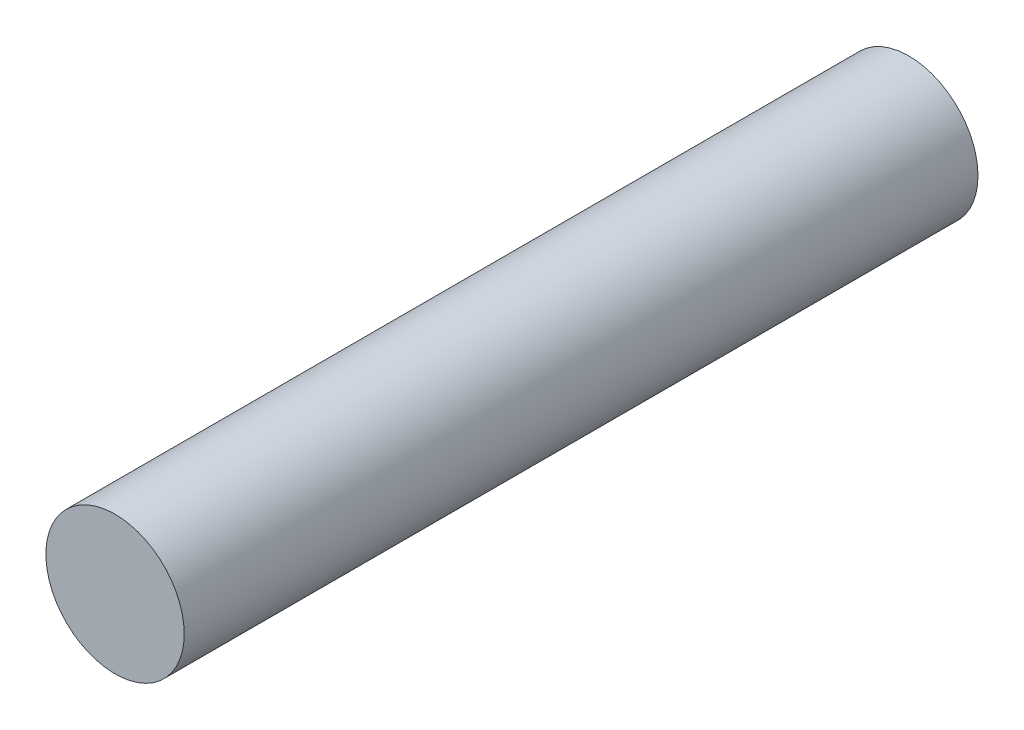
ISO-10303-21;
HEADER;
FILE_DESCRIPTION(('STEP AP214'),'2;1');
FILE_NAME('part.step','',(''),(''),'','','');
FILE_SCHEMA(('AUTOMOTIVE_DESIGN { 1 0 10303 214 1 1 1 1 }'));
ENDSEC;
DATA;
#1=APPLICATION_CONTEXT('core data for automotive mechanical design processes');
#2=APPLICATION_PROTOCOL_DEFINITION('international standard','automotive_design',2000,#1);
#3=PRODUCT_CONTEXT('',#1,'mechanical');
#4=PRODUCT('Part','Part','',(#3));
#5=PRODUCT_RELATED_PRODUCT_CATEGORY('part','',(#4));
#6=PRODUCT_DEFINITION_FORMATION('','',#4);
#7=PRODUCT_DEFINITION_CONTEXT('part definition',#1,'design');
#8=PRODUCT_DEFINITION('design','',#6,#7);
#9=PRODUCT_DEFINITION_SHAPE('','',#8);
#10=(LENGTH_UNIT() NAMED_UNIT(*) SI_UNIT(.MILLI.,.METRE.));
#11=(NAMED_UNIT(*) PLANE_ANGLE_UNIT() SI_UNIT($,.RADIAN.));
#12=(NAMED_UNIT(*) SI_UNIT($,.STERADIAN.) SOLID_ANGLE_UNIT());
#13=UNCERTAINTY_MEASURE_WITH_UNIT(LENGTH_MEASURE(1.E-05),#10,'distance_accuracy_value','');
#14=(GEOMETRIC_REPRESENTATION_CONTEXT(3) GLOBAL_UNCERTAINTY_ASSIGNED_CONTEXT((#13)) GLOBAL_UNIT_ASSIGNED_CONTEXT((#10,
#11,#12)) REPRESENTATION_CONTEXT('',''));
#15=CARTESIAN_POINT('',(0.,0.,0.));
#16=DIRECTION('',(0.,0.,1.));
#17=DIRECTION('',(1.,0.,0.));
#18=AXIS2_PLACEMENT_3D('',#15,#16,#17);
#19=CARTESIAN_POINT('',(0.,0.,20.655));
#20=DIRECTION('',(0.,0.,-1.));
#21=DIRECTION('',(-1.,0.,0.));
#22=AXIS2_PLACEMENT_3D('',#19,#20,#21);
#23=CYLINDRICAL_SURFACE('',#22,2.4);
#24=CARTESIAN_POINT('',(0.,0.,20.655));
#25=DIRECTION('',(0.,0.,1.));
#26=DIRECTION('',(1.,0.,0.));
#27=AXIS2_PLACEMENT_3D('',#24,#25,#26);
#28=CIRCLE('',#27,2.4);
#29=CARTESIAN_POINT('',(2.4,0.,20.655));
#30=VERTEX_POINT('',#29);
#31=EDGE_CURVE('E10',#30,#30,#28,.T.);
#32=ORIENTED_EDGE('',*,*,#31,.F.);
#33=EDGE_LOOP('',(#32));
#34=FACE_BOUND('',#33,.T.);
#35=CARTESIAN_POINT('',(0.,0.,-6.885));
#36=DIRECTION('',(0.,0.,1.));
#37=DIRECTION('',(1.,0.,0.));
#38=AXIS2_PLACEMENT_3D('',#35,#36,#37);
#39=CIRCLE('',#38,2.4);
#40=CARTESIAN_POINT('',(2.4,0.,-6.885));
#41=VERTEX_POINT('',#40);
#42=EDGE_CURVE('E36',#41,#41,#39,.T.);
#43=ORIENTED_EDGE('',*,*,#42,.T.);
#44=EDGE_LOOP('',(#43));
#45=FACE_BOUND('',#44,.T.);
#46=ADVANCED_FACE('F33',(#34,#45),#23,.T.);
#47=CARTESIAN_POINT('',(0.,0.,20.655));
#48=DIRECTION('',(0.,0.,1.));
#49=DIRECTION('',(1.,0.,0.));
#50=AXIS2_PLACEMENT_3D('',#47,#48,#49);
#51=PLANE('',#50);
#52=ORIENTED_EDGE('',*,*,#31,.T.);
#53=EDGE_LOOP('',(#52));
#54=FACE_BOUND('',#53,.T.);
#55=ADVANCED_FACE('F48',(#54),#51,.T.);
#56=CARTESIAN_POINT('',(0.,0.,-6.885));
#57=DIRECTION('',(0.,0.,1.));
#58=DIRECTION('',(1.,0.,0.));
#59=AXIS2_PLACEMENT_3D('',#56,#57,#58);
#60=PLANE('',#59);
#61=ORIENTED_EDGE('',*,*,#42,.F.);
#62=EDGE_LOOP('',(#61));
#63=FACE_BOUND('',#62,.T.);
#64=ADVANCED_FACE('F46',(#63),#60,.F.);
#65=CLOSED_SHELL('',(#46,#55,#64));
#66=MANIFOLD_SOLID_BREP('B2',#65);
#67=ADVANCED_BREP_SHAPE_REPRESENTATION('',(#18,#66),#14);
#68=SHAPE_DEFINITION_REPRESENTATION(#9,#67);
ENDSEC;
END-ISO-10303-21;
